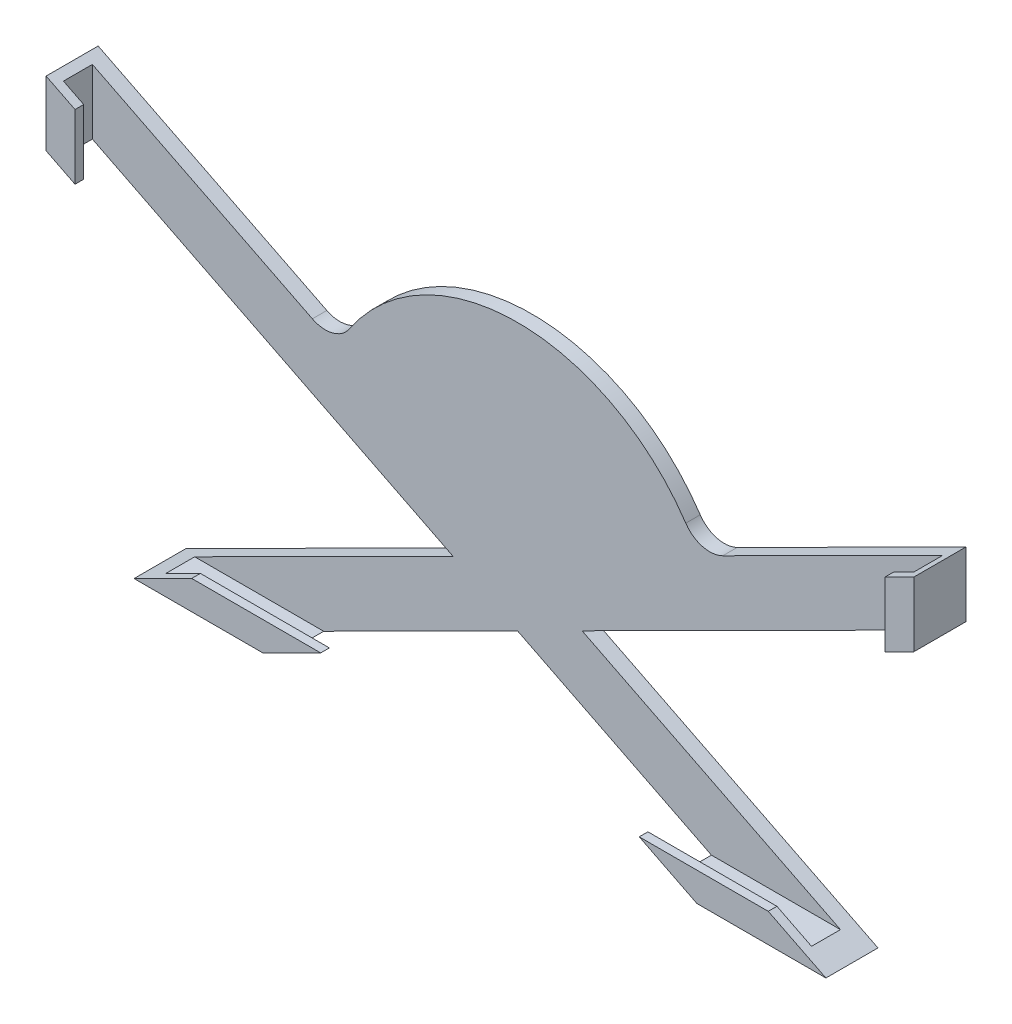
ISO-10303-21;
HEADER;
FILE_DESCRIPTION(('STEP AP214'),'2;1');
FILE_NAME('part.step','',(''),(''),'','','');
FILE_SCHEMA(('AUTOMOTIVE_DESIGN { 1 0 10303 214 1 1 1 1 }'));
ENDSEC;
DATA;
#1=APPLICATION_CONTEXT('core data for automotive mechanical design processes');
#2=APPLICATION_PROTOCOL_DEFINITION('international standard','automotive_design',2000,#1);
#3=PRODUCT_CONTEXT('',#1,'mechanical');
#4=PRODUCT('Part','Part','',(#3));
#5=PRODUCT_RELATED_PRODUCT_CATEGORY('part','',(#4));
#6=PRODUCT_DEFINITION_FORMATION('','',#4);
#7=PRODUCT_DEFINITION_CONTEXT('part definition',#1,'design');
#8=PRODUCT_DEFINITION('design','',#6,#7);
#9=PRODUCT_DEFINITION_SHAPE('','',#8);
#10=(LENGTH_UNIT() NAMED_UNIT(*) SI_UNIT(.MILLI.,.METRE.));
#11=(NAMED_UNIT(*) PLANE_ANGLE_UNIT() SI_UNIT($,.RADIAN.));
#12=(NAMED_UNIT(*) SI_UNIT($,.STERADIAN.) SOLID_ANGLE_UNIT());
#13=UNCERTAINTY_MEASURE_WITH_UNIT(LENGTH_MEASURE(1.E-05),#10,'distance_accuracy_value','');
#14=(GEOMETRIC_REPRESENTATION_CONTEXT(3) GLOBAL_UNCERTAINTY_ASSIGNED_CONTEXT((#13)) GLOBAL_UNIT_ASSIGNED_CONTEXT((#10,
#11,#12)) REPRESENTATION_CONTEXT('',''));
#15=CARTESIAN_POINT('',(0.,0.,0.));
#16=DIRECTION('',(0.,0.,1.));
#17=DIRECTION('',(1.,0.,0.));
#18=AXIS2_PLACEMENT_3D('',#15,#16,#17);
#19=CARTESIAN_POINT('',(150.,75.2489160917054,5.));
#20=DIRECTION('',(0.448399812294502,-0.893833098701461,0.));
#21=DIRECTION('',(0.893833098701461,0.448399812294502,0.));
#22=AXIS2_PLACEMENT_3D('',#19,#20,#21);
#23=PLANE('',#22);
#24=DIRECTION('',(-0.893833098701461,-0.448399812294502,0.));
#25=VECTOR('',#24,1.);
#26=CARTESIAN_POINT('',(150.,75.2489160917054,0.));
#27=LINE('',#26,#25);
#28=CARTESIAN_POINT('',(150.,75.2489160917054,0.));
#29=VERTEX_POINT('',#28);
#30=CARTESIAN_POINT('',(70.9458027828695,35.5906317377789,0.));
#31=VERTEX_POINT('',#30);
#32=EDGE_CURVE('E433',#29,#31,#27,.T.);
#33=ORIENTED_EDGE('',*,*,#32,.T.);
#34=DIRECTION('',(0.,0.,1.));
#35=VECTOR('',#34,1.);
#36=CARTESIAN_POINT('',(70.9458027828695,35.5906317377788,5.));
#37=LINE('',#36,#35);
#38=CARTESIAN_POINT('',(70.9458027828695,35.5906317377789,5.));
#39=VERTEX_POINT('',#38);
#40=EDGE_CURVE('E60',#31,#39,#37,.T.);
#41=ORIENTED_EDGE('',*,*,#40,.T.);
#42=DIRECTION('',(-0.893833098701461,-0.448399812294502,0.));
#43=VECTOR('',#42,1.);
#44=CARTESIAN_POINT('',(150.,75.2489160917054,5.));
#45=LINE('',#44,#43);
#46=CARTESIAN_POINT('',(147.,73.7439377698713,5.));
#47=VERTEX_POINT('',#46);
#48=EDGE_CURVE('E408',#47,#39,#45,.T.);
#49=ORIENTED_EDGE('',*,*,#48,.F.);
#50=DIRECTION('',(0.,0.,-1.));
#51=VECTOR('',#50,1.);
#52=CARTESIAN_POINT('',(147.,73.7439377698713,15.));
#53=LINE('',#52,#51);
#54=CARTESIAN_POINT('',(147.,73.7439377698713,15.));
#55=VERTEX_POINT('',#54);
#56=EDGE_CURVE('E371',#55,#47,#53,.T.);
#57=ORIENTED_EDGE('',*,*,#56,.F.);
#58=DIRECTION('',(-0.893833098701461,-0.448399812294502,0.));
#59=VECTOR('',#58,1.);
#60=CARTESIAN_POINT('',(150.,75.2489160917054,15.));
#61=LINE('',#60,#59);
#62=CARTESIAN_POINT('',(140.,70.2323216855917,15.));
#63=VERTEX_POINT('',#62);
#64=EDGE_CURVE('E254',#55,#63,#61,.T.);
#65=ORIENTED_EDGE('',*,*,#64,.T.);
#66=DIRECTION('',(0.,0.,-1.));
#67=VECTOR('',#66,1.);
#68=CARTESIAN_POINT('',(140.,70.2323216855917,18.));
#69=LINE('',#68,#67);
#70=CARTESIAN_POINT('',(140.,70.2323216855917,18.));
#71=VERTEX_POINT('',#70);
#72=EDGE_CURVE('E250',#71,#63,#69,.T.);
#73=ORIENTED_EDGE('',*,*,#72,.F.);
#74=DIRECTION('',(-0.893833098701461,-0.448399812294502,0.));
#75=VECTOR('',#74,1.);
#76=CARTESIAN_POINT('',(150.,75.2489160917054,18.));
#77=LINE('',#76,#75);
#78=CARTESIAN_POINT('',(150.,75.2489160917054,18.));
#79=VERTEX_POINT('',#78);
#80=EDGE_CURVE('E271',#79,#71,#77,.T.);
#81=ORIENTED_EDGE('',*,*,#80,.F.);
#82=DIRECTION('',(0.,0.,-1.));
#83=VECTOR('',#82,1.);
#84=CARTESIAN_POINT('',(150.,75.2489160917054,5.));
#85=LINE('',#84,#83);
#86=EDGE_CURVE('E438',#79,#29,#85,.T.);
#87=ORIENTED_EDGE('',*,*,#86,.T.);
#88=EDGE_LOOP('',(#33,#41,#49,#57,#65,#73,#81,#87));
#89=FACE_BOUND('',#88,.T.);
#90=ADVANCED_FACE('F39',(#89),#23,.F.);
#91=CARTESIAN_POINT('',(-150.,75.2489160917054,5.));
#92=DIRECTION('',(-0.448399812294502,-0.893833098701461,0.));
#93=DIRECTION('',(0.893833098701461,-0.448399812294502,0.));
#94=AXIS2_PLACEMENT_3D('',#91,#92,#93);
#95=PLANE('',#94);
#96=DIRECTION('',(-0.893833098701461,0.448399812294502,0.));
#97=VECTOR('',#96,1.);
#98=CARTESIAN_POINT('',(-150.,75.2489160917054,5.));
#99=LINE('',#98,#97);
#100=CARTESIAN_POINT('',(-70.9458027828695,35.5906317377789,5.));
#101=VERTEX_POINT('',#100);
#102=CARTESIAN_POINT('',(-147.,73.7439377698713,5.));
#103=VERTEX_POINT('',#102);
#104=EDGE_CURVE('E410',#101,#103,#99,.T.);
#105=ORIENTED_EDGE('',*,*,#104,.F.);
#106=DIRECTION('',(0.,0.,1.));
#107=VECTOR('',#106,1.);
#108=CARTESIAN_POINT('',(-70.9458027828695,35.5906317377788,0.));
#109=LINE('',#108,#107);
#110=CARTESIAN_POINT('',(-70.9458027828695,35.5906317377789,0.));
#111=VERTEX_POINT('',#110);
#112=EDGE_CURVE('E468',#101,#111,#109,.F.);
#113=ORIENTED_EDGE('',*,*,#112,.T.);
#114=DIRECTION('',(-0.893833098701461,0.448399812294502,0.));
#115=VECTOR('',#114,1.);
#116=CARTESIAN_POINT('',(-150.,75.2489160917054,0.));
#117=LINE('',#116,#115);
#118=CARTESIAN_POINT('',(-150.,75.2489160917054,0.));
#119=VERTEX_POINT('',#118);
#120=EDGE_CURVE('E398',#111,#119,#117,.T.);
#121=ORIENTED_EDGE('',*,*,#120,.T.);
#122=DIRECTION('',(0.,0.,-1.));
#123=VECTOR('',#122,1.);
#124=CARTESIAN_POINT('',(-150.,75.2489160917054,5.));
#125=LINE('',#124,#123);
#126=CARTESIAN_POINT('',(-150.,75.2489160917054,18.));
#127=VERTEX_POINT('',#126);
#128=EDGE_CURVE('E412',#127,#119,#125,.T.);
#129=ORIENTED_EDGE('',*,*,#128,.F.);
#130=DIRECTION('',(-0.893833098701461,0.448399812294502,0.));
#131=VECTOR('',#130,1.);
#132=CARTESIAN_POINT('',(-140.,70.2323216855917,18.));
#133=LINE('',#132,#131);
#134=CARTESIAN_POINT('',(-140.,70.2323216855917,18.));
#135=VERTEX_POINT('',#134);
#136=EDGE_CURVE('E327',#135,#127,#133,.T.);
#137=ORIENTED_EDGE('',*,*,#136,.F.);
#138=DIRECTION('',(0.,0.,-1.));
#139=VECTOR('',#138,1.);
#140=CARTESIAN_POINT('',(-140.,70.2323216855917,18.));
#141=LINE('',#140,#139);
#142=CARTESIAN_POINT('',(-140.,70.2323216855917,15.));
#143=VERTEX_POINT('',#142);
#144=EDGE_CURVE('E338',#135,#143,#141,.T.);
#145=ORIENTED_EDGE('',*,*,#144,.T.);
#146=DIRECTION('',(-0.893833098701461,0.448399812294502,0.));
#147=VECTOR('',#146,1.);
#148=CARTESIAN_POINT('',(-140.,70.2323216855917,15.));
#149=LINE('',#148,#147);
#150=CARTESIAN_POINT('',(-147.,73.7439377698713,15.));
#151=VERTEX_POINT('',#150);
#152=EDGE_CURVE('E318',#143,#151,#149,.T.);
#153=ORIENTED_EDGE('',*,*,#152,.T.);
#154=DIRECTION('',(0.,0.,-1.));
#155=VECTOR('',#154,1.);
#156=CARTESIAN_POINT('',(-147.,73.7439377698713,15.));
#157=LINE('',#156,#155);
#158=EDGE_CURVE('E386',#151,#103,#157,.T.);
#159=ORIENTED_EDGE('',*,*,#158,.T.);
#160=EDGE_LOOP('',(#105,#113,#121,#129,#137,#145,#153,#159));
#161=FACE_BOUND('',#160,.T.);
#162=ADVANCED_FACE('F491',(#161),#95,.F.);
#163=CARTESIAN_POINT('',(0.,0.,5.));
#164=DIRECTION('',(0.,0.,1.));
#165=DIRECTION('',(1.,0.,0.));
#166=AXIS2_PLACEMENT_3D('',#163,#164,#165);
#167=PLANE('',#166);
#168=ORIENTED_EDGE('',*,*,#48,.T.);
#169=CARTESIAN_POINT('',(66.4618046599245,44.5289627247935,5.));
#170=DIRECTION('',(0.,0.,1.));
#171=DIRECTION('',(1.,0.,0.));
#172=AXIS2_PLACEMENT_3D('',#169,#170,#171);
#173=CIRCLE('',#172,10.);
#174=CARTESIAN_POINT('',(58.1540790774339,38.9628423841943,5.));
#175=VERTEX_POINT('',#174);
#176=EDGE_CURVE('E11',#39,#175,#173,.F.);
#177=ORIENTED_EDGE('',*,*,#176,.T.);
#178=CARTESIAN_POINT('',(0.,0.,5.));
#179=DIRECTION('',(0.,0.,1.));
#180=DIRECTION('',(-1.,0.,0.));
#181=AXIS2_PLACEMENT_3D('',#178,#179,#180);
#182=CIRCLE('',#181,70.);
#183=CARTESIAN_POINT('',(-58.1540790774339,38.9628423841943,5.));
#184=VERTEX_POINT('',#183);
#185=EDGE_CURVE('E486',#175,#184,#182,.T.);
#186=ORIENTED_EDGE('',*,*,#185,.T.);
#187=CARTESIAN_POINT('',(-66.4618046599245,44.5289627247935,5.));
#188=DIRECTION('',(0.,0.,1.));
#189=DIRECTION('',(1.,0.,0.));
#190=AXIS2_PLACEMENT_3D('',#187,#188,#189);
#191=CIRCLE('',#190,10.);
#192=EDGE_CURVE('E479',#184,#101,#191,.F.);
#193=ORIENTED_EDGE('',*,*,#192,.T.);
#194=ORIENTED_EDGE('',*,*,#104,.T.);
#195=DIRECTION('',(0.,1.,0.));
#196=VECTOR('',#195,1.);
#197=CARTESIAN_POINT('',(-147.,51.368395815724,5.));
#198=LINE('',#197,#196);
#199=CARTESIAN_POINT('',(-147.,51.368395815724,5.));
#200=VERTEX_POINT('',#199);
#201=EDGE_CURVE('E381',#200,#103,#198,.T.);
#202=ORIENTED_EDGE('',*,*,#201,.F.);
#203=DIRECTION('',(0.893833098701461,-0.448399812294502,0.));
#204=VECTOR('',#203,1.);
#205=CARTESIAN_POINT('',(-150.,52.8733741375581,5.));
#206=LINE('',#205,#204);
#207=CARTESIAN_POINT('',(-22.3015258388024,-11.1877709770736,5.));
#208=VERTEX_POINT('',#207);
#209=EDGE_CURVE('E395',#200,#208,#206,.T.);
#210=ORIENTED_EDGE('',*,*,#209,.T.);
#211=DIRECTION('',(-0.893833098701461,-0.448399812294502,0.));
#212=VECTOR('',#211,1.);
#213=CARTESIAN_POINT('',(-22.3015258388024,-11.1877709770736,5.));
#214=LINE('',#213,#212);
#215=CARTESIAN_POINT('',(-111.629514899098,-56.,5.));
#216=VERTEX_POINT('',#215);
#217=EDGE_CURVE('E397',#208,#216,#214,.T.);
#218=ORIENTED_EDGE('',*,*,#217,.T.);
#219=DIRECTION('',(-1.,0.,0.));
#220=VECTOR('',#219,1.);
#221=CARTESIAN_POINT('',(-111.629514899098,-56.,5.));
#222=LINE('',#221,#220);
#223=CARTESIAN_POINT('',(-67.026463221493,-56.,5.));
#224=VERTEX_POINT('',#223);
#225=EDGE_CURVE('E356',#224,#216,#222,.T.);
#226=ORIENTED_EDGE('',*,*,#225,.F.);
#227=DIRECTION('',(0.893833098701461,0.448399812294502,0.));
#228=VECTOR('',#227,1.);
#229=CARTESIAN_POINT('',(0.,-22.3755419541473,5.));
#230=LINE('',#229,#228);
#231=CARTESIAN_POINT('',(0.,-22.3755419541473,5.));
#232=VERTEX_POINT('',#231);
#233=EDGE_CURVE('E400',#224,#232,#230,.T.);
#234=ORIENTED_EDGE('',*,*,#233,.T.);
#235=DIRECTION('',(0.893833098701461,-0.448399812294502,0.));
#236=VECTOR('',#235,1.);
#237=CARTESIAN_POINT('',(0.,-22.3755419541473,5.));
#238=LINE('',#237,#236);
#239=CARTESIAN_POINT('',(67.026463221493,-56.,5.));
#240=VERTEX_POINT('',#239);
#241=EDGE_CURVE('E402',#232,#240,#238,.T.);
#242=ORIENTED_EDGE('',*,*,#241,.T.);
#243=DIRECTION('',(-1.,0.,0.));
#244=VECTOR('',#243,1.);
#245=CARTESIAN_POINT('',(111.629514899098,-56.,5.));
#246=LINE('',#245,#244);
#247=CARTESIAN_POINT('',(111.629514899098,-56.,5.));
#248=VERTEX_POINT('',#247);
#249=EDGE_CURVE('E368',#248,#240,#246,.T.);
#250=ORIENTED_EDGE('',*,*,#249,.F.);
#251=DIRECTION('',(-0.893833098701461,0.448399812294502,0.));
#252=VECTOR('',#251,1.);
#253=CARTESIAN_POINT('',(22.3015258388025,-11.1877709770736,5.));
#254=LINE('',#253,#252);
#255=CARTESIAN_POINT('',(22.3015258388025,-11.1877709770736,5.));
#256=VERTEX_POINT('',#255);
#257=EDGE_CURVE('E404',#248,#256,#254,.T.);
#258=ORIENTED_EDGE('',*,*,#257,.T.);
#259=DIRECTION('',(0.893833098701461,0.448399812294502,0.));
#260=VECTOR('',#259,1.);
#261=CARTESIAN_POINT('',(150.,52.8733741375581,5.));
#262=LINE('',#261,#260);
#263=CARTESIAN_POINT('',(147.,51.368395815724,5.));
#264=VERTEX_POINT('',#263);
#265=EDGE_CURVE('E406',#256,#264,#262,.T.);
#266=ORIENTED_EDGE('',*,*,#265,.T.);
#267=DIRECTION('',(0.,-1.,0.));
#268=VECTOR('',#267,1.);
#269=CARTESIAN_POINT('',(147.,73.7439377698713,5.));
#270=LINE('',#269,#268);
#271=EDGE_CURVE('E378',#47,#264,#270,.T.);
#272=ORIENTED_EDGE('',*,*,#271,.F.);
#273=EDGE_LOOP('',(#168,#177,#186,#193,#194,#202,#210,#218,#226,#234,#242,#250,#258,#266,#272));
#274=FACE_BOUND('',#273,.T.);
#275=ADVANCED_FACE('F484',(#274),#167,.T.);
#276=CARTESIAN_POINT('',(-150.,75.2489160917054,5.));
#277=DIRECTION('',(1.,0.,0.));
#278=DIRECTION('',(0.,0.,-1.));
#279=AXIS2_PLACEMENT_3D('',#276,#277,#278);
#280=PLANE('',#279);
#281=DIRECTION('',(0.,-1.,0.));
#282=VECTOR('',#281,1.);
#283=CARTESIAN_POINT('',(-150.,75.2489160917054,0.));
#284=LINE('',#283,#282);
#285=CARTESIAN_POINT('',(-150.,52.8733741375581,0.));
#286=VERTEX_POINT('',#285);
#287=EDGE_CURVE('E394',#119,#286,#284,.T.);
#288=ORIENTED_EDGE('',*,*,#287,.T.);
#289=DIRECTION('',(0.,0.,-1.));
#290=VECTOR('',#289,1.);
#291=CARTESIAN_POINT('',(-150.,52.8733741375581,5.));
#292=LINE('',#291,#290);
#293=CARTESIAN_POINT('',(-150.,52.8733741375581,18.));
#294=VERTEX_POINT('',#293);
#295=EDGE_CURVE('E465',#294,#286,#292,.T.);
#296=ORIENTED_EDGE('',*,*,#295,.F.);
#297=DIRECTION('',(0.,-1.,0.));
#298=VECTOR('',#297,1.);
#299=CARTESIAN_POINT('',(-150.,75.2489160917054,18.));
#300=LINE('',#299,#298);
#301=EDGE_CURVE('E330',#127,#294,#300,.T.);
#302=ORIENTED_EDGE('',*,*,#301,.F.);
#303=ORIENTED_EDGE('',*,*,#128,.T.);
#304=EDGE_LOOP('',(#288,#296,#302,#303));
#305=FACE_BOUND('',#304,.T.);
#306=ADVANCED_FACE('F597',(#305),#280,.F.);
#307=CARTESIAN_POINT('',(-150.,52.8733741375581,5.));
#308=DIRECTION('',(0.448399812294502,0.893833098701461,0.));
#309=DIRECTION('',(-0.893833098701461,0.448399812294502,0.));
#310=AXIS2_PLACEMENT_3D('',#307,#308,#309);
#311=PLANE('',#310);
#312=DIRECTION('',(0.893833098701461,-0.448399812294502,0.));
#313=VECTOR('',#312,1.);
#314=CARTESIAN_POINT('',(-150.,52.8733741375581,0.));
#315=LINE('',#314,#313);
#316=CARTESIAN_POINT('',(-22.3015258388024,-11.1877709770736,0.));
#317=VERTEX_POINT('',#316);
#318=EDGE_CURVE('E415',#286,#317,#315,.T.);
#319=ORIENTED_EDGE('',*,*,#318,.T.);
#320=DIRECTION('',(0.,0.,-1.));
#321=VECTOR('',#320,1.);
#322=CARTESIAN_POINT('',(-22.3015258388024,-11.1877709770736,5.));
#323=LINE('',#322,#321);
#324=EDGE_CURVE('E462',#208,#317,#323,.T.);
#325=ORIENTED_EDGE('',*,*,#324,.F.);
#326=ORIENTED_EDGE('',*,*,#209,.F.);
#327=DIRECTION('',(0.,0.,-1.));
#328=VECTOR('',#327,1.);
#329=CARTESIAN_POINT('',(-147.,51.368395815724,15.));
#330=LINE('',#329,#328);
#331=CARTESIAN_POINT('',(-147.,51.368395815724,15.));
#332=VERTEX_POINT('',#331);
#333=EDGE_CURVE('E391',#332,#200,#330,.T.);
#334=ORIENTED_EDGE('',*,*,#333,.F.);
#335=DIRECTION('',(0.893833098701461,-0.448399812294502,0.));
#336=VECTOR('',#335,1.);
#337=CARTESIAN_POINT('',(-150.,52.8733741375581,15.));
#338=LINE('',#337,#336);
#339=CARTESIAN_POINT('',(-140.,47.8567797314444,15.));
#340=VERTEX_POINT('',#339);
#341=EDGE_CURVE('E341',#332,#340,#338,.T.);
#342=ORIENTED_EDGE('',*,*,#341,.T.);
#343=DIRECTION('',(0.,0.,-1.));
#344=VECTOR('',#343,1.);
#345=CARTESIAN_POINT('',(-140.,47.8567797314444,18.));
#346=LINE('',#345,#344);
#347=CARTESIAN_POINT('',(-140.,47.8567797314444,18.));
#348=VERTEX_POINT('',#347);
#349=EDGE_CURVE('E346',#348,#340,#346,.T.);
#350=ORIENTED_EDGE('',*,*,#349,.F.);
#351=DIRECTION('',(0.893833098701461,-0.448399812294502,0.));
#352=VECTOR('',#351,1.);
#353=CARTESIAN_POINT('',(-150.,52.8733741375581,18.));
#354=LINE('',#353,#352);
#355=EDGE_CURVE('E334',#294,#348,#354,.T.);
#356=ORIENTED_EDGE('',*,*,#355,.F.);
#357=ORIENTED_EDGE('',*,*,#295,.T.);
#358=EDGE_LOOP('',(#319,#325,#326,#334,#342,#350,#356,#357));
#359=FACE_BOUND('',#358,.T.);
#360=ADVANCED_FACE('F593',(#359),#311,.F.);
#361=CARTESIAN_POINT('',(-22.3015258388024,-11.1877709770736,5.));
#362=DIRECTION('',(0.448399812294502,-0.893833098701461,0.));
#363=DIRECTION('',(0.893833098701461,0.448399812294502,0.));
#364=AXIS2_PLACEMENT_3D('',#361,#362,#363);
#365=PLANE('',#364);
#366=DIRECTION('',(-0.893833098701461,-0.448399812294502,0.));
#367=VECTOR('',#366,1.);
#368=CARTESIAN_POINT('',(-22.3015258388024,-11.1877709770736,0.));
#369=LINE('',#368,#367);
#370=CARTESIAN_POINT('',(-119.603051677605,-60.,0.));
#371=VERTEX_POINT('',#370);
#372=EDGE_CURVE('E417',#317,#371,#369,.T.);
#373=ORIENTED_EDGE('',*,*,#372,.T.);
#374=DIRECTION('',(0.,0.,-1.));
#375=VECTOR('',#374,1.);
#376=CARTESIAN_POINT('',(-119.603051677605,-60.,5.));
#377=LINE('',#376,#375);
#378=CARTESIAN_POINT('',(-119.603051677605,-60.,18.));
#379=VERTEX_POINT('',#378);
#380=EDGE_CURVE('E459',#379,#371,#377,.T.);
#381=ORIENTED_EDGE('',*,*,#380,.F.);
#382=DIRECTION('',(-0.893833098701461,-0.448399812294502,0.));
#383=VECTOR('',#382,1.);
#384=CARTESIAN_POINT('',(-99.6692097313374,-50.,18.));
#385=LINE('',#384,#383);
#386=CARTESIAN_POINT('',(-99.6692097313374,-50.,18.));
#387=VERTEX_POINT('',#386);
#388=EDGE_CURVE('E309',#387,#379,#385,.T.);
#389=ORIENTED_EDGE('',*,*,#388,.F.);
#390=DIRECTION('',(0.,0.,-1.));
#391=VECTOR('',#390,1.);
#392=CARTESIAN_POINT('',(-99.6692097313374,-50.,18.));
#393=LINE('',#392,#391);
#394=CARTESIAN_POINT('',(-99.6692097313374,-50.,15.));
#395=VERTEX_POINT('',#394);
#396=EDGE_CURVE('E306',#387,#395,#393,.T.);
#397=ORIENTED_EDGE('',*,*,#396,.T.);
#398=DIRECTION('',(-0.893833098701461,-0.448399812294502,0.));
#399=VECTOR('',#398,1.);
#400=CARTESIAN_POINT('',(-99.6692097313374,-50.,15.));
#401=LINE('',#400,#399);
#402=CARTESIAN_POINT('',(-111.629514899098,-56.,15.));
#403=VERTEX_POINT('',#402);
#404=EDGE_CURVE('E310',#395,#403,#401,.T.);
#405=ORIENTED_EDGE('',*,*,#404,.T.);
#406=DIRECTION('',(0.,0.,-1.));
#407=VECTOR('',#406,1.);
#408=CARTESIAN_POINT('',(-111.629514899098,-56.,15.));
#409=LINE('',#408,#407);
#410=EDGE_CURVE('E352',#403,#216,#409,.T.);
#411=ORIENTED_EDGE('',*,*,#410,.T.);
#412=ORIENTED_EDGE('',*,*,#217,.F.);
#413=ORIENTED_EDGE('',*,*,#324,.T.);
#414=EDGE_LOOP('',(#373,#381,#389,#397,#405,#411,#412,#413));
#415=FACE_BOUND('',#414,.T.);
#416=ADVANCED_FACE('F589',(#415),#365,.F.);
#417=CARTESIAN_POINT('',(-119.603051677605,-60.,5.));
#418=DIRECTION('',(0.,1.,0.));
#419=DIRECTION('',(0.,0.,1.));
#420=AXIS2_PLACEMENT_3D('',#417,#418,#419);
#421=PLANE('',#420);
#422=DIRECTION('',(1.,0.,0.));
#423=VECTOR('',#422,1.);
#424=CARTESIAN_POINT('',(-119.603051677605,-60.,0.));
#425=LINE('',#424,#423);
#426=CARTESIAN_POINT('',(-75.,-60.,0.));
#427=VERTEX_POINT('',#426);
#428=EDGE_CURVE('E419',#371,#427,#425,.T.);
#429=ORIENTED_EDGE('',*,*,#428,.T.);
#430=DIRECTION('',(0.,0.,-1.));
#431=VECTOR('',#430,1.);
#432=CARTESIAN_POINT('',(-75.,-60.,5.));
#433=LINE('',#432,#431);
#434=CARTESIAN_POINT('',(-75.,-60.,18.));
#435=VERTEX_POINT('',#434);
#436=EDGE_CURVE('E456',#435,#427,#433,.T.);
#437=ORIENTED_EDGE('',*,*,#436,.F.);
#438=DIRECTION('',(1.,0.,0.));
#439=VECTOR('',#438,1.);
#440=CARTESIAN_POINT('',(-119.603051677605,-60.,18.));
#441=LINE('',#440,#439);
#442=EDGE_CURVE('E314',#379,#435,#441,.T.);
#443=ORIENTED_EDGE('',*,*,#442,.F.);
#444=ORIENTED_EDGE('',*,*,#380,.T.);
#445=EDGE_LOOP('',(#429,#437,#443,#444));
#446=FACE_BOUND('',#445,.T.);
#447=ADVANCED_FACE('F586',(#446),#421,.F.);
#448=CARTESIAN_POINT('',(0.,-22.3755419541473,5.));
#449=DIRECTION('',(-0.448399812294502,0.893833098701461,0.));
#450=DIRECTION('',(-0.893833098701461,-0.448399812294502,0.));
#451=AXIS2_PLACEMENT_3D('',#448,#449,#450);
#452=PLANE('',#451);
#453=DIRECTION('',(0.893833098701461,0.448399812294502,0.));
#454=VECTOR('',#453,1.);
#455=CARTESIAN_POINT('',(0.,-22.3755419541473,0.));
#456=LINE('',#455,#454);
#457=CARTESIAN_POINT('',(0.,-22.3755419541473,0.));
#458=VERTEX_POINT('',#457);
#459=EDGE_CURVE('E421',#427,#458,#456,.T.);
#460=ORIENTED_EDGE('',*,*,#459,.T.);
#461=DIRECTION('',(0.,0.,-1.));
#462=VECTOR('',#461,1.);
#463=CARTESIAN_POINT('',(0.,-22.3755419541473,5.));
#464=LINE('',#463,#462);
#465=EDGE_CURVE('E453',#232,#458,#464,.T.);
#466=ORIENTED_EDGE('',*,*,#465,.F.);
#467=ORIENTED_EDGE('',*,*,#233,.F.);
#468=DIRECTION('',(0.,0.,-1.));
#469=VECTOR('',#468,1.);
#470=CARTESIAN_POINT('',(-67.026463221493,-56.,15.));
#471=LINE('',#470,#469);
#472=CARTESIAN_POINT('',(-67.026463221493,-56.,15.));
#473=VERTEX_POINT('',#472);
#474=EDGE_CURVE('E349',#473,#224,#471,.T.);
#475=ORIENTED_EDGE('',*,*,#474,.F.);
#476=DIRECTION('',(0.893833098701461,0.448399812294502,0.));
#477=VECTOR('',#476,1.);
#478=CARTESIAN_POINT('',(-75.,-60.,15.));
#479=LINE('',#478,#477);
#480=CARTESIAN_POINT('',(-55.0661580537325,-50.,15.));
#481=VERTEX_POINT('',#480);
#482=EDGE_CURVE('E316',#473,#481,#479,.T.);
#483=ORIENTED_EDGE('',*,*,#482,.T.);
#484=DIRECTION('',(0.,0.,-1.));
#485=VECTOR('',#484,1.);
#486=CARTESIAN_POINT('',(-55.0661580537325,-50.,18.));
#487=LINE('',#486,#485);
#488=CARTESIAN_POINT('',(-55.0661580537325,-50.,18.));
#489=VERTEX_POINT('',#488);
#490=EDGE_CURVE('E295',#489,#481,#487,.T.);
#491=ORIENTED_EDGE('',*,*,#490,.F.);
#492=DIRECTION('',(0.893833098701461,0.448399812294502,0.));
#493=VECTOR('',#492,1.);
#494=CARTESIAN_POINT('',(-75.,-60.,18.));
#495=LINE('',#494,#493);
#496=EDGE_CURVE('E323',#435,#489,#495,.T.);
#497=ORIENTED_EDGE('',*,*,#496,.F.);
#498=ORIENTED_EDGE('',*,*,#436,.T.);
#499=EDGE_LOOP('',(#460,#466,#467,#475,#483,#491,#497,#498));
#500=FACE_BOUND('',#499,.T.);
#501=ADVANCED_FACE('F541',(#500),#452,.F.);
#502=CARTESIAN_POINT('',(0.,-22.3755419541473,5.));
#503=DIRECTION('',(0.448399812294502,0.893833098701461,0.));
#504=DIRECTION('',(-0.893833098701461,0.448399812294502,0.));
#505=AXIS2_PLACEMENT_3D('',#502,#503,#504);
#506=PLANE('',#505);
#507=DIRECTION('',(0.893833098701461,-0.448399812294502,0.));
#508=VECTOR('',#507,1.);
#509=CARTESIAN_POINT('',(0.,-22.3755419541473,0.));
#510=LINE('',#509,#508);
#511=CARTESIAN_POINT('',(75.,-60.,0.));
#512=VERTEX_POINT('',#511);
#513=EDGE_CURVE('E423',#458,#512,#510,.T.);
#514=ORIENTED_EDGE('',*,*,#513,.T.);
#515=DIRECTION('',(0.,0.,-1.));
#516=VECTOR('',#515,1.);
#517=CARTESIAN_POINT('',(75.,-60.,5.));
#518=LINE('',#517,#516);
#519=CARTESIAN_POINT('',(75.,-60.,18.));
#520=VERTEX_POINT('',#519);
#521=EDGE_CURVE('E450',#520,#512,#518,.T.);
#522=ORIENTED_EDGE('',*,*,#521,.F.);
#523=DIRECTION('',(0.893833098701461,-0.448399812294502,0.));
#524=VECTOR('',#523,1.);
#525=CARTESIAN_POINT('',(55.0661580537325,-50.,18.));
#526=LINE('',#525,#524);
#527=CARTESIAN_POINT('',(55.0661580537325,-50.,18.));
#528=VERTEX_POINT('',#527);
#529=EDGE_CURVE('E290',#528,#520,#526,.T.);
#530=ORIENTED_EDGE('',*,*,#529,.F.);
#531=DIRECTION('',(0.,0.,-1.));
#532=VECTOR('',#531,1.);
#533=CARTESIAN_POINT('',(55.0661580537325,-50.,18.));
#534=LINE('',#533,#532);
#535=CARTESIAN_POINT('',(55.0661580537325,-50.,15.));
#536=VERTEX_POINT('',#535);
#537=EDGE_CURVE('E283',#528,#536,#534,.T.);
#538=ORIENTED_EDGE('',*,*,#537,.T.);
#539=DIRECTION('',(0.893833098701461,-0.448399812294502,0.));
#540=VECTOR('',#539,1.);
#541=CARTESIAN_POINT('',(55.0661580537325,-50.,15.));
#542=LINE('',#541,#540);
#543=CARTESIAN_POINT('',(67.0264632214931,-56.,15.));
#544=VERTEX_POINT('',#543);
#545=EDGE_CURVE('E292',#536,#544,#542,.T.);
#546=ORIENTED_EDGE('',*,*,#545,.T.);
#547=DIRECTION('',(0.,0.,-1.));
#548=VECTOR('',#547,1.);
#549=CARTESIAN_POINT('',(67.026463221493,-56.,15.));
#550=LINE('',#549,#548);
#551=EDGE_CURVE('E364',#544,#240,#550,.T.);
#552=ORIENTED_EDGE('',*,*,#551,.T.);
#553=ORIENTED_EDGE('',*,*,#241,.F.);
#554=ORIENTED_EDGE('',*,*,#465,.T.);
#555=EDGE_LOOP('',(#514,#522,#530,#538,#546,#552,#553,#554));
#556=FACE_BOUND('',#555,.T.);
#557=ADVANCED_FACE('F533',(#556),#506,.F.);
#558=CARTESIAN_POINT('',(75.,-60.,5.));
#559=DIRECTION('',(0.,1.,0.));
#560=DIRECTION('',(0.,0.,1.));
#561=AXIS2_PLACEMENT_3D('',#558,#559,#560);
#562=PLANE('',#561);
#563=DIRECTION('',(1.,0.,0.));
#564=VECTOR('',#563,1.);
#565=CARTESIAN_POINT('',(75.,-60.,0.));
#566=LINE('',#565,#564);
#567=CARTESIAN_POINT('',(119.603051677605,-60.,0.));
#568=VERTEX_POINT('',#567);
#569=EDGE_CURVE('E425',#512,#568,#566,.T.);
#570=ORIENTED_EDGE('',*,*,#569,.T.);
#571=DIRECTION('',(0.,0.,-1.));
#572=VECTOR('',#571,1.);
#573=CARTESIAN_POINT('',(119.603051677605,-60.,5.));
#574=LINE('',#573,#572);
#575=CARTESIAN_POINT('',(119.603051677605,-60.,18.));
#576=VERTEX_POINT('',#575);
#577=EDGE_CURVE('E447',#576,#568,#574,.T.);
#578=ORIENTED_EDGE('',*,*,#577,.F.);
#579=DIRECTION('',(1.,0.,0.));
#580=VECTOR('',#579,1.);
#581=CARTESIAN_POINT('',(75.,-60.,18.));
#582=LINE('',#581,#580);
#583=EDGE_CURVE('E299',#520,#576,#582,.T.);
#584=ORIENTED_EDGE('',*,*,#583,.F.);
#585=ORIENTED_EDGE('',*,*,#521,.T.);
#586=EDGE_LOOP('',(#570,#578,#584,#585));
#587=FACE_BOUND('',#586,.T.);
#588=ADVANCED_FACE('F526',(#587),#562,.F.);
#589=CARTESIAN_POINT('',(22.3015258388025,-11.1877709770736,5.));
#590=DIRECTION('',(-0.448399812294502,-0.893833098701461,0.));
#591=DIRECTION('',(0.893833098701461,-0.448399812294502,0.));
#592=AXIS2_PLACEMENT_3D('',#589,#590,#591);
#593=PLANE('',#592);
#594=DIRECTION('',(-0.893833098701461,0.448399812294502,0.));
#595=VECTOR('',#594,1.);
#596=CARTESIAN_POINT('',(22.3015258388025,-11.1877709770736,0.));
#597=LINE('',#596,#595);
#598=CARTESIAN_POINT('',(22.3015258388025,-11.1877709770736,0.));
#599=VERTEX_POINT('',#598);
#600=EDGE_CURVE('E427',#568,#599,#597,.T.);
#601=ORIENTED_EDGE('',*,*,#600,.T.);
#602=DIRECTION('',(0.,0.,-1.));
#603=VECTOR('',#602,1.);
#604=CARTESIAN_POINT('',(22.3015258388025,-11.1877709770736,5.));
#605=LINE('',#604,#603);
#606=EDGE_CURVE('E444',#256,#599,#605,.T.);
#607=ORIENTED_EDGE('',*,*,#606,.F.);
#608=ORIENTED_EDGE('',*,*,#257,.F.);
#609=DIRECTION('',(0.,0.,-1.));
#610=VECTOR('',#609,1.);
#611=CARTESIAN_POINT('',(111.629514899098,-56.,15.));
#612=LINE('',#611,#610);
#613=CARTESIAN_POINT('',(111.629514899098,-56.,15.));
#614=VERTEX_POINT('',#613);
#615=EDGE_CURVE('E359',#614,#248,#612,.T.);
#616=ORIENTED_EDGE('',*,*,#615,.F.);
#617=DIRECTION('',(-0.893833098701461,0.448399812294502,0.));
#618=VECTOR('',#617,1.);
#619=CARTESIAN_POINT('',(119.603051677605,-60.,15.));
#620=LINE('',#619,#618);
#621=CARTESIAN_POINT('',(99.6692097313374,-50.,15.));
#622=VERTEX_POINT('',#621);
#623=EDGE_CURVE('E289',#614,#622,#620,.T.);
#624=ORIENTED_EDGE('',*,*,#623,.T.);
#625=DIRECTION('',(0.,0.,-1.));
#626=VECTOR('',#625,1.);
#627=CARTESIAN_POINT('',(99.6692097313374,-50.,18.));
#628=LINE('',#627,#626);
#629=CARTESIAN_POINT('',(99.6692097313374,-50.,18.));
#630=VERTEX_POINT('',#629);
#631=EDGE_CURVE('E276',#630,#622,#628,.T.);
#632=ORIENTED_EDGE('',*,*,#631,.F.);
#633=DIRECTION('',(-0.893833098701461,0.448399812294502,0.));
#634=VECTOR('',#633,1.);
#635=CARTESIAN_POINT('',(119.603051677605,-60.,18.));
#636=LINE('',#635,#634);
#637=EDGE_CURVE('E297',#576,#630,#636,.T.);
#638=ORIENTED_EDGE('',*,*,#637,.F.);
#639=ORIENTED_EDGE('',*,*,#577,.T.);
#640=EDGE_LOOP('',(#601,#607,#608,#616,#624,#632,#638,#639));
#641=FACE_BOUND('',#640,.T.);
#642=ADVANCED_FACE('F520',(#641),#593,.F.);
#643=CARTESIAN_POINT('',(150.,52.8733741375581,5.));
#644=DIRECTION('',(-0.448399812294502,0.893833098701461,0.));
#645=DIRECTION('',(-0.893833098701461,-0.448399812294502,0.));
#646=AXIS2_PLACEMENT_3D('',#643,#644,#645);
#647=PLANE('',#646);
#648=DIRECTION('',(0.893833098701461,0.448399812294502,0.));
#649=VECTOR('',#648,1.);
#650=CARTESIAN_POINT('',(150.,52.8733741375581,0.));
#651=LINE('',#650,#649);
#652=CARTESIAN_POINT('',(150.,52.8733741375581,0.));
#653=VERTEX_POINT('',#652);
#654=EDGE_CURVE('E429',#599,#653,#651,.T.);
#655=ORIENTED_EDGE('',*,*,#654,.T.);
#656=DIRECTION('',(0.,0.,-1.));
#657=VECTOR('',#656,1.);
#658=CARTESIAN_POINT('',(150.,52.8733741375581,5.));
#659=LINE('',#658,#657);
#660=CARTESIAN_POINT('',(150.,52.8733741375581,18.));
#661=VERTEX_POINT('',#660);
#662=EDGE_CURVE('E441',#661,#653,#659,.T.);
#663=ORIENTED_EDGE('',*,*,#662,.F.);
#664=DIRECTION('',(0.89383309870146,0.448399812294503,0.));
#665=VECTOR('',#664,1.);
#666=CARTESIAN_POINT('',(140.,47.8567797314444,18.));
#667=LINE('',#666,#665);
#668=CARTESIAN_POINT('',(140.,47.8567797314444,18.));
#669=VERTEX_POINT('',#668);
#670=EDGE_CURVE('E262',#669,#661,#667,.T.);
#671=ORIENTED_EDGE('',*,*,#670,.F.);
#672=DIRECTION('',(0.,0.,-1.));
#673=VECTOR('',#672,1.);
#674=CARTESIAN_POINT('',(140.,47.8567797314444,18.));
#675=LINE('',#674,#673);
#676=CARTESIAN_POINT('',(140.,47.8567797314444,15.));
#677=VERTEX_POINT('',#676);
#678=EDGE_CURVE('E247',#669,#677,#675,.T.);
#679=ORIENTED_EDGE('',*,*,#678,.T.);
#680=DIRECTION('',(0.89383309870146,0.448399812294503,0.));
#681=VECTOR('',#680,1.);
#682=CARTESIAN_POINT('',(140.,47.8567797314444,15.));
#683=LINE('',#682,#681);
#684=CARTESIAN_POINT('',(147.,51.368395815724,15.));
#685=VERTEX_POINT('',#684);
#686=EDGE_CURVE('E255',#677,#685,#683,.T.);
#687=ORIENTED_EDGE('',*,*,#686,.T.);
#688=DIRECTION('',(0.,0.,-1.));
#689=VECTOR('',#688,1.);
#690=CARTESIAN_POINT('',(147.,51.368395815724,15.));
#691=LINE('',#690,#689);
#692=EDGE_CURVE('E376',#685,#264,#691,.T.);
#693=ORIENTED_EDGE('',*,*,#692,.T.);
#694=ORIENTED_EDGE('',*,*,#265,.F.);
#695=ORIENTED_EDGE('',*,*,#606,.T.);
#696=EDGE_LOOP('',(#655,#663,#671,#679,#687,#693,#694,#695));
#697=FACE_BOUND('',#696,.T.);
#698=ADVANCED_FACE('F259',(#697),#647,.F.);
#699=CARTESIAN_POINT('',(150.,75.2489160917054,5.));
#700=DIRECTION('',(-1.,0.,0.));
#701=DIRECTION('',(0.,0.,1.));
#702=AXIS2_PLACEMENT_3D('',#699,#700,#701);
#703=PLANE('',#702);
#704=DIRECTION('',(0.,1.,0.));
#705=VECTOR('',#704,1.);
#706=CARTESIAN_POINT('',(150.,75.2489160917054,0.));
#707=LINE('',#706,#705);
#708=EDGE_CURVE('E431',#653,#29,#707,.T.);
#709=ORIENTED_EDGE('',*,*,#708,.T.);
#710=ORIENTED_EDGE('',*,*,#86,.F.);
#711=DIRECTION('',(0.,1.,0.));
#712=VECTOR('',#711,1.);
#713=CARTESIAN_POINT('',(150.,52.8733741375581,18.));
#714=LINE('',#713,#712);
#715=EDGE_CURVE('E268',#661,#79,#714,.T.);
#716=ORIENTED_EDGE('',*,*,#715,.F.);
#717=ORIENTED_EDGE('',*,*,#662,.T.);
#718=EDGE_LOOP('',(#709,#710,#716,#717));
#719=FACE_BOUND('',#718,.T.);
#720=ADVANCED_FACE('F512',(#719),#703,.F.);
#721=CARTESIAN_POINT('',(0.,0.,0.));
#722=DIRECTION('',(0.,0.,1.));
#723=DIRECTION('',(1.,0.,0.));
#724=AXIS2_PLACEMENT_3D('',#721,#722,#723);
#725=PLANE('',#724);
#726=CARTESIAN_POINT('',(0.,0.,0.));
#727=DIRECTION('',(0.,0.,1.));
#728=DIRECTION('',(-1.,0.,0.));
#729=AXIS2_PLACEMENT_3D('',#726,#727,#728);
#730=CIRCLE('',#729,70.);
#731=CARTESIAN_POINT('',(58.1540790774339,38.9628423841943,0.));
#732=VERTEX_POINT('',#731);
#733=CARTESIAN_POINT('',(-58.1540790774339,38.9628423841943,0.));
#734=VERTEX_POINT('',#733);
#735=EDGE_CURVE('E496',#732,#734,#730,.T.);
#736=ORIENTED_EDGE('',*,*,#735,.F.);
#737=CARTESIAN_POINT('',(66.4618046599245,44.5289627247935,0.));
#738=DIRECTION('',(0.,0.,1.));
#739=DIRECTION('',(1.,0.,0.));
#740=AXIS2_PLACEMENT_3D('',#737,#738,#739);
#741=CIRCLE('',#740,10.);
#742=EDGE_CURVE('E47',#732,#31,#741,.T.);
#743=ORIENTED_EDGE('',*,*,#742,.T.);
#744=ORIENTED_EDGE('',*,*,#32,.F.);
#745=ORIENTED_EDGE('',*,*,#708,.F.);
#746=ORIENTED_EDGE('',*,*,#654,.F.);
#747=ORIENTED_EDGE('',*,*,#600,.F.);
#748=ORIENTED_EDGE('',*,*,#569,.F.);
#749=ORIENTED_EDGE('',*,*,#513,.F.);
#750=ORIENTED_EDGE('',*,*,#459,.F.);
#751=ORIENTED_EDGE('',*,*,#428,.F.);
#752=ORIENTED_EDGE('',*,*,#372,.F.);
#753=ORIENTED_EDGE('',*,*,#318,.F.);
#754=ORIENTED_EDGE('',*,*,#287,.F.);
#755=ORIENTED_EDGE('',*,*,#120,.F.);
#756=CARTESIAN_POINT('',(-66.4618046599245,44.5289627247935,0.));
#757=DIRECTION('',(0.,0.,1.));
#758=DIRECTION('',(1.,0.,0.));
#759=AXIS2_PLACEMENT_3D('',#756,#757,#758);
#760=CIRCLE('',#759,10.);
#761=EDGE_CURVE('E477',#111,#734,#760,.T.);
#762=ORIENTED_EDGE('',*,*,#761,.T.);
#763=EDGE_LOOP('',(#736,#743,#744,#745,#746,#747,#748,#749,#750,#751,#752,#753,#754,#755,#762));
#764=FACE_BOUND('',#763,.T.);
#765=ADVANCED_FACE('F495',(#764),#725,.F.);
#766=CARTESIAN_POINT('',(-147.,51.368395815724,15.));
#767=DIRECTION('',(-1.,0.,0.));
#768=DIRECTION('',(0.,0.,1.));
#769=AXIS2_PLACEMENT_3D('',#766,#767,#768);
#770=PLANE('',#769);
#771=ORIENTED_EDGE('',*,*,#201,.T.);
#772=ORIENTED_EDGE('',*,*,#158,.F.);
#773=DIRECTION('',(0.,1.,0.));
#774=VECTOR('',#773,1.);
#775=CARTESIAN_POINT('',(-147.,51.368395815724,15.));
#776=LINE('',#775,#774);
#777=EDGE_CURVE('E383',#332,#151,#776,.T.);
#778=ORIENTED_EDGE('',*,*,#777,.F.);
#779=ORIENTED_EDGE('',*,*,#333,.T.);
#780=EDGE_LOOP('',(#771,#772,#778,#779));
#781=FACE_BOUND('',#780,.T.);
#782=ADVANCED_FACE('F648',(#781),#770,.F.);
#783=CARTESIAN_POINT('',(147.,73.7439377698713,15.));
#784=DIRECTION('',(1.,0.,0.));
#785=DIRECTION('',(0.,0.,-1.));
#786=AXIS2_PLACEMENT_3D('',#783,#784,#785);
#787=PLANE('',#786);
#788=ORIENTED_EDGE('',*,*,#271,.T.);
#789=ORIENTED_EDGE('',*,*,#692,.F.);
#790=DIRECTION('',(0.,-1.,0.));
#791=VECTOR('',#790,1.);
#792=CARTESIAN_POINT('',(147.,73.7439377698713,15.));
#793=LINE('',#792,#791);
#794=EDGE_CURVE('E267',#55,#685,#793,.T.);
#795=ORIENTED_EDGE('',*,*,#794,.F.);
#796=ORIENTED_EDGE('',*,*,#56,.T.);
#797=EDGE_LOOP('',(#788,#789,#795,#796));
#798=FACE_BOUND('',#797,.T.);
#799=ADVANCED_FACE('F506',(#798),#787,.F.);
#800=CARTESIAN_POINT('',(111.629514899098,-56.,15.));
#801=DIRECTION('',(0.,-1.,0.));
#802=DIRECTION('',(0.,0.,-1.));
#803=AXIS2_PLACEMENT_3D('',#800,#801,#802);
#804=PLANE('',#803);
#805=ORIENTED_EDGE('',*,*,#249,.T.);
#806=ORIENTED_EDGE('',*,*,#551,.F.);
#807=DIRECTION('',(-1.,0.,0.));
#808=VECTOR('',#807,1.);
#809=CARTESIAN_POINT('',(111.629514899098,-56.,15.));
#810=LINE('',#809,#808);
#811=EDGE_CURVE('E367',#614,#544,#810,.T.);
#812=ORIENTED_EDGE('',*,*,#811,.F.);
#813=ORIENTED_EDGE('',*,*,#615,.T.);
#814=EDGE_LOOP('',(#805,#806,#812,#813));
#815=FACE_BOUND('',#814,.T.);
#816=ADVANCED_FACE('F546',(#815),#804,.F.);
#817=CARTESIAN_POINT('',(-111.629514899098,-56.,15.));
#818=DIRECTION('',(0.,-1.,0.));
#819=DIRECTION('',(1.,0.,0.));
#820=AXIS2_PLACEMENT_3D('',#817,#818,#819);
#821=PLANE('',#820);
#822=ORIENTED_EDGE('',*,*,#225,.T.);
#823=ORIENTED_EDGE('',*,*,#410,.F.);
#824=DIRECTION('',(-1.,0.,0.));
#825=VECTOR('',#824,1.);
#826=CARTESIAN_POINT('',(-111.629514899098,-56.,15.));
#827=LINE('',#826,#825);
#828=EDGE_CURVE('E355',#473,#403,#827,.T.);
#829=ORIENTED_EDGE('',*,*,#828,.F.);
#830=ORIENTED_EDGE('',*,*,#474,.T.);
#831=EDGE_LOOP('',(#822,#823,#829,#830));
#832=FACE_BOUND('',#831,.T.);
#833=ADVANCED_FACE('F636',(#832),#821,.F.);
#834=CARTESIAN_POINT('',(0.,0.,15.));
#835=DIRECTION('',(0.,0.,1.));
#836=DIRECTION('',(1.,0.,0.));
#837=AXIS2_PLACEMENT_3D('',#834,#835,#836);
#838=PLANE('',#837);
#839=ORIENTED_EDGE('',*,*,#341,.F.);
#840=ORIENTED_EDGE('',*,*,#777,.T.);
#841=ORIENTED_EDGE('',*,*,#152,.F.);
#842=DIRECTION('',(0.,1.,0.));
#843=VECTOR('',#842,1.);
#844=CARTESIAN_POINT('',(-140.,47.8567797314444,15.));
#845=LINE('',#844,#843);
#846=EDGE_CURVE('E331',#340,#143,#845,.T.);
#847=ORIENTED_EDGE('',*,*,#846,.F.);
#848=EDGE_LOOP('',(#839,#840,#841,#847));
#849=FACE_BOUND('',#848,.T.);
#850=ADVANCED_FACE('F633',(#849),#838,.F.);
#851=CARTESIAN_POINT('',(-140.,47.8567797314444,18.));
#852=DIRECTION('',(-1.,0.,0.));
#853=DIRECTION('',(0.,0.,1.));
#854=AXIS2_PLACEMENT_3D('',#851,#852,#853);
#855=PLANE('',#854);
#856=ORIENTED_EDGE('',*,*,#846,.T.);
#857=ORIENTED_EDGE('',*,*,#144,.F.);
#858=DIRECTION('',(0.,1.,0.));
#859=VECTOR('',#858,1.);
#860=CARTESIAN_POINT('',(-140.,47.8567797314444,18.));
#861=LINE('',#860,#859);
#862=EDGE_CURVE('E336',#348,#135,#861,.T.);
#863=ORIENTED_EDGE('',*,*,#862,.F.);
#864=ORIENTED_EDGE('',*,*,#349,.T.);
#865=EDGE_LOOP('',(#856,#857,#863,#864));
#866=FACE_BOUND('',#865,.T.);
#867=ADVANCED_FACE('F631',(#866),#855,.F.);
#868=CARTESIAN_POINT('',(0.,0.,18.));
#869=DIRECTION('',(0.,0.,1.));
#870=DIRECTION('',(1.,0.,0.));
#871=AXIS2_PLACEMENT_3D('',#868,#869,#870);
#872=PLANE('',#871);
#873=ORIENTED_EDGE('',*,*,#136,.T.);
#874=ORIENTED_EDGE('',*,*,#301,.T.);
#875=ORIENTED_EDGE('',*,*,#355,.T.);
#876=ORIENTED_EDGE('',*,*,#862,.T.);
#877=EDGE_LOOP('',(#873,#874,#875,#876));
#878=FACE_BOUND('',#877,.T.);
#879=ADVANCED_FACE('F626',(#878),#872,.T.);
#880=CARTESIAN_POINT('',(0.,0.,15.));
#881=DIRECTION('',(0.,0.,1.));
#882=DIRECTION('',(1.,0.,0.));
#883=AXIS2_PLACEMENT_3D('',#880,#881,#882);
#884=PLANE('',#883);
#885=ORIENTED_EDGE('',*,*,#482,.F.);
#886=ORIENTED_EDGE('',*,*,#828,.T.);
#887=ORIENTED_EDGE('',*,*,#404,.F.);
#888=DIRECTION('',(-1.,0.,0.));
#889=VECTOR('',#888,1.);
#890=CARTESIAN_POINT('',(-55.0661580537325,-50.,15.));
#891=LINE('',#890,#889);
#892=EDGE_CURVE('E313',#481,#395,#891,.T.);
#893=ORIENTED_EDGE('',*,*,#892,.F.);
#894=EDGE_LOOP('',(#885,#886,#887,#893));
#895=FACE_BOUND('',#894,.T.);
#896=ADVANCED_FACE('F623',(#895),#884,.F.);
#897=CARTESIAN_POINT('',(-55.0661580537325,-50.,18.));
#898=DIRECTION('',(0.,-1.,0.));
#899=DIRECTION('',(1.,0.,0.));
#900=AXIS2_PLACEMENT_3D('',#897,#898,#899);
#901=PLANE('',#900);
#902=ORIENTED_EDGE('',*,*,#892,.T.);
#903=ORIENTED_EDGE('',*,*,#396,.F.);
#904=DIRECTION('',(-1.,0.,0.));
#905=VECTOR('',#904,1.);
#906=CARTESIAN_POINT('',(-55.0661580537325,-50.,18.));
#907=LINE('',#906,#905);
#908=EDGE_CURVE('E321',#489,#387,#907,.T.);
#909=ORIENTED_EDGE('',*,*,#908,.F.);
#910=ORIENTED_EDGE('',*,*,#490,.T.);
#911=EDGE_LOOP('',(#902,#903,#909,#910));
#912=FACE_BOUND('',#911,.T.);
#913=ADVANCED_FACE('F562',(#912),#901,.F.);
#914=CARTESIAN_POINT('',(0.,0.,18.));
#915=DIRECTION('',(0.,0.,1.));
#916=DIRECTION('',(1.,0.,0.));
#917=AXIS2_PLACEMENT_3D('',#914,#915,#916);
#918=PLANE('',#917);
#919=ORIENTED_EDGE('',*,*,#442,.T.);
#920=ORIENTED_EDGE('',*,*,#496,.T.);
#921=ORIENTED_EDGE('',*,*,#908,.T.);
#922=ORIENTED_EDGE('',*,*,#388,.T.);
#923=EDGE_LOOP('',(#919,#920,#921,#922));
#924=FACE_BOUND('',#923,.T.);
#925=ADVANCED_FACE('F555',(#924),#918,.T.);
#926=CARTESIAN_POINT('',(0.,0.,15.));
#927=DIRECTION('',(0.,0.,1.));
#928=DIRECTION('',(1.,0.,0.));
#929=AXIS2_PLACEMENT_3D('',#926,#927,#928);
#930=PLANE('',#929);
#931=ORIENTED_EDGE('',*,*,#623,.F.);
#932=ORIENTED_EDGE('',*,*,#811,.T.);
#933=ORIENTED_EDGE('',*,*,#545,.F.);
#934=DIRECTION('',(-1.,0.,0.));
#935=VECTOR('',#934,1.);
#936=CARTESIAN_POINT('',(99.6692097313374,-50.,15.));
#937=LINE('',#936,#935);
#938=EDGE_CURVE('E287',#622,#536,#937,.T.);
#939=ORIENTED_EDGE('',*,*,#938,.F.);
#940=EDGE_LOOP('',(#931,#932,#933,#939));
#941=FACE_BOUND('',#940,.T.);
#942=ADVANCED_FACE('F553',(#941),#930,.F.);
#943=CARTESIAN_POINT('',(99.6692097313374,-50.,18.));
#944=DIRECTION('',(0.,-1.,0.));
#945=DIRECTION('',(1.,0.,0.));
#946=AXIS2_PLACEMENT_3D('',#943,#944,#945);
#947=PLANE('',#946);
#948=ORIENTED_EDGE('',*,*,#938,.T.);
#949=ORIENTED_EDGE('',*,*,#537,.F.);
#950=DIRECTION('',(-1.,0.,0.));
#951=VECTOR('',#950,1.);
#952=CARTESIAN_POINT('',(99.6692097313374,-50.,18.));
#953=LINE('',#952,#951);
#954=EDGE_CURVE('E286',#630,#528,#953,.T.);
#955=ORIENTED_EDGE('',*,*,#954,.F.);
#956=ORIENTED_EDGE('',*,*,#631,.T.);
#957=EDGE_LOOP('',(#948,#949,#955,#956));
#958=FACE_BOUND('',#957,.T.);
#959=ADVANCED_FACE('F552',(#958),#947,.F.);
#960=CARTESIAN_POINT('',(0.,0.,18.));
#961=DIRECTION('',(0.,0.,1.));
#962=DIRECTION('',(1.,0.,0.));
#963=AXIS2_PLACEMENT_3D('',#960,#961,#962);
#964=PLANE('',#963);
#965=ORIENTED_EDGE('',*,*,#529,.T.);
#966=ORIENTED_EDGE('',*,*,#583,.T.);
#967=ORIENTED_EDGE('',*,*,#637,.T.);
#968=ORIENTED_EDGE('',*,*,#954,.T.);
#969=EDGE_LOOP('',(#965,#966,#967,#968));
#970=FACE_BOUND('',#969,.T.);
#971=ADVANCED_FACE('F528',(#970),#964,.T.);
#972=CARTESIAN_POINT('',(0.,0.,15.));
#973=DIRECTION('',(0.,0.,1.));
#974=DIRECTION('',(1.,0.,0.));
#975=AXIS2_PLACEMENT_3D('',#972,#973,#974);
#976=PLANE('',#975);
#977=ORIENTED_EDGE('',*,*,#64,.F.);
#978=ORIENTED_EDGE('',*,*,#794,.T.);
#979=ORIENTED_EDGE('',*,*,#686,.F.);
#980=DIRECTION('',(0.,-1.,0.));
#981=VECTOR('',#980,1.);
#982=CARTESIAN_POINT('',(140.,70.2323216855917,15.));
#983=LINE('',#982,#981);
#984=EDGE_CURVE('E243',#63,#677,#983,.T.);
#985=ORIENTED_EDGE('',*,*,#984,.F.);
#986=EDGE_LOOP('',(#977,#978,#979,#985));
#987=FACE_BOUND('',#986,.T.);
#988=ADVANCED_FACE('F265',(#987),#976,.F.);
#989=CARTESIAN_POINT('',(140.,70.2323216855917,18.));
#990=DIRECTION('',(1.,0.,0.));
#991=DIRECTION('',(0.,0.,-1.));
#992=AXIS2_PLACEMENT_3D('',#989,#990,#991);
#993=PLANE('',#992);
#994=ORIENTED_EDGE('',*,*,#984,.T.);
#995=ORIENTED_EDGE('',*,*,#678,.F.);
#996=DIRECTION('',(0.,-1.,0.));
#997=VECTOR('',#996,1.);
#998=CARTESIAN_POINT('',(140.,70.2323216855917,18.));
#999=LINE('',#998,#997);
#1000=EDGE_CURVE('E278',#71,#669,#999,.T.);
#1001=ORIENTED_EDGE('',*,*,#1000,.F.);
#1002=ORIENTED_EDGE('',*,*,#72,.T.);
#1003=EDGE_LOOP('',(#994,#995,#1001,#1002));
#1004=FACE_BOUND('',#1003,.T.);
#1005=ADVANCED_FACE('F245',(#1004),#993,.F.);
#1006=CARTESIAN_POINT('',(0.,0.,18.));
#1007=DIRECTION('',(0.,0.,1.));
#1008=DIRECTION('',(1.,0.,0.));
#1009=AXIS2_PLACEMENT_3D('',#1006,#1007,#1008);
#1010=PLANE('',#1009);
#1011=ORIENTED_EDGE('',*,*,#715,.T.);
#1012=ORIENTED_EDGE('',*,*,#80,.T.);
#1013=ORIENTED_EDGE('',*,*,#1000,.T.);
#1014=ORIENTED_EDGE('',*,*,#670,.T.);
#1015=EDGE_LOOP('',(#1011,#1012,#1013,#1014));
#1016=FACE_BOUND('',#1015,.T.);
#1017=ADVANCED_FACE('F509',(#1016),#1010,.T.);
#1018=CARTESIAN_POINT('',(0.,0.,5.));
#1019=DIRECTION('',(0.,0.,-1.));
#1020=DIRECTION('',(-1.,0.,0.));
#1021=AXIS2_PLACEMENT_3D('',#1018,#1019,#1020);
#1022=CYLINDRICAL_SURFACE('',#1021,70.);
#1023=ORIENTED_EDGE('',*,*,#735,.T.);
#1024=DIRECTION('',(0.,0.,-1.));
#1025=VECTOR('',#1024,1.);
#1026=CARTESIAN_POINT('',(-58.1540790774339,38.9628423841943,5.));
#1027=LINE('',#1026,#1025);
#1028=EDGE_CURVE('E474',#734,#184,#1027,.F.);
#1029=ORIENTED_EDGE('',*,*,#1028,.T.);
#1030=ORIENTED_EDGE('',*,*,#185,.F.);
#1031=DIRECTION('',(0.,0.,-1.));
#1032=VECTOR('',#1031,1.);
#1033=CARTESIAN_POINT('',(58.1540790774339,38.9628423841943,5.));
#1034=LINE('',#1033,#1032);
#1035=EDGE_CURVE('E471',#175,#732,#1034,.T.);
#1036=ORIENTED_EDGE('',*,*,#1035,.T.);
#1037=EDGE_LOOP('',(#1023,#1029,#1030,#1036));
#1038=FACE_BOUND('',#1037,.T.);
#1039=ADVANCED_FACE('F499',(#1038),#1022,.T.);
#1040=CARTESIAN_POINT('',(-66.4618046599245,44.5289627247935,5.));
#1041=DIRECTION('',(0.,0.,-1.));
#1042=DIRECTION('',(-1.,0.,0.));
#1043=AXIS2_PLACEMENT_3D('',#1040,#1041,#1042);
#1044=CYLINDRICAL_SURFACE('',#1043,10.);
#1045=ORIENTED_EDGE('',*,*,#192,.F.);
#1046=ORIENTED_EDGE('',*,*,#1028,.F.);
#1047=ORIENTED_EDGE('',*,*,#761,.F.);
#1048=ORIENTED_EDGE('',*,*,#112,.F.);
#1049=EDGE_LOOP('',(#1045,#1046,#1047,#1048));
#1050=FACE_BOUND('',#1049,.T.);
#1051=ADVANCED_FACE('F493',(#1050),#1044,.F.);
#1052=CARTESIAN_POINT('',(66.4618046599245,44.5289627247935,5.));
#1053=DIRECTION('',(0.,0.,-1.));
#1054=DIRECTION('',(-1.,0.,0.));
#1055=AXIS2_PLACEMENT_3D('',#1052,#1053,#1054);
#1056=CYLINDRICAL_SURFACE('',#1055,10.);
#1057=ORIENTED_EDGE('',*,*,#176,.F.);
#1058=ORIENTED_EDGE('',*,*,#40,.F.);
#1059=ORIENTED_EDGE('',*,*,#742,.F.);
#1060=ORIENTED_EDGE('',*,*,#1035,.F.);
#1061=EDGE_LOOP('',(#1057,#1058,#1059,#1060));
#1062=FACE_BOUND('',#1061,.T.);
#1063=ADVANCED_FACE('F41',(#1062),#1056,.F.);
#1064=CLOSED_SHELL('',(#90,#162,#275,#306,#360,#416,#447,#501,#557,#588,#642,#698,#720,#765,
#782,#799,#816,#833,#850,#867,#879,#896,#913,#925,#942,#959,#971,#988,#1005,#1017,#1039,#1051,#1063));
#1065=MANIFOLD_SOLID_BREP('B2',#1064);
#1066=ADVANCED_BREP_SHAPE_REPRESENTATION('',(#18,#1065),#14);
#1067=SHAPE_DEFINITION_REPRESENTATION(#9,#1066);
ENDSEC;
END-ISO-10303-21;
